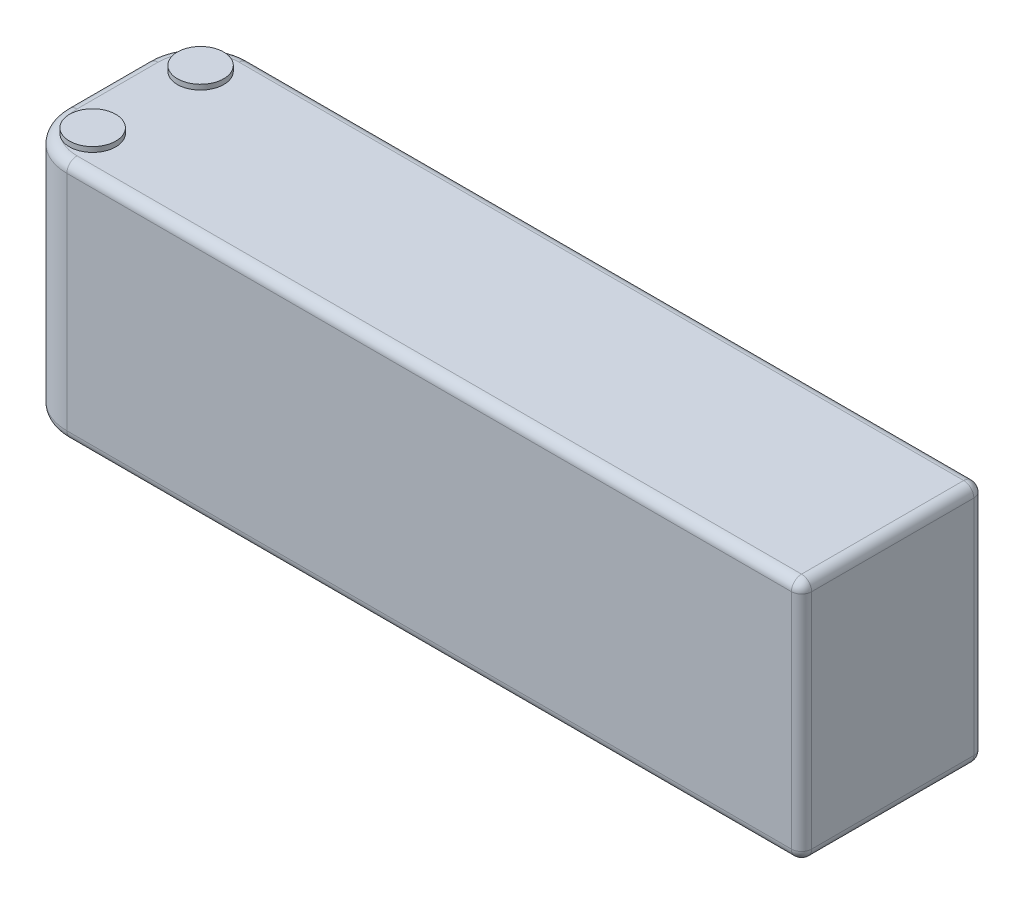
ISO-10303-21;
HEADER;
FILE_DESCRIPTION(('STEP AP214'),'2;1');
FILE_NAME('part.step','',(''),(''),'','','');
FILE_SCHEMA(('AUTOMOTIVE_DESIGN { 1 0 10303 214 1 1 1 1 }'));
ENDSEC;
DATA;
#1=APPLICATION_CONTEXT('core data for automotive mechanical design processes');
#2=APPLICATION_PROTOCOL_DEFINITION('international standard','automotive_design',2000,#1);
#3=PRODUCT_CONTEXT('',#1,'mechanical');
#4=PRODUCT('Part','Part','',(#3));
#5=PRODUCT_RELATED_PRODUCT_CATEGORY('part','',(#4));
#6=PRODUCT_DEFINITION_FORMATION('','',#4);
#7=PRODUCT_DEFINITION_CONTEXT('part definition',#1,'design');
#8=PRODUCT_DEFINITION('design','',#6,#7);
#9=PRODUCT_DEFINITION_SHAPE('','',#8);
#10=(LENGTH_UNIT() NAMED_UNIT(*) SI_UNIT(.MILLI.,.METRE.));
#11=(NAMED_UNIT(*) PLANE_ANGLE_UNIT() SI_UNIT($,.RADIAN.));
#12=(NAMED_UNIT(*) SI_UNIT($,.STERADIAN.) SOLID_ANGLE_UNIT());
#13=UNCERTAINTY_MEASURE_WITH_UNIT(LENGTH_MEASURE(1.E-05),#10,'distance_accuracy_value','');
#14=(GEOMETRIC_REPRESENTATION_CONTEXT(3) GLOBAL_UNCERTAINTY_ASSIGNED_CONTEXT((#13)) GLOBAL_UNIT_ASSIGNED_CONTEXT((#10,
#11,#12)) REPRESENTATION_CONTEXT('',''));
#15=CARTESIAN_POINT('',(0.,0.,0.));
#16=DIRECTION('',(0.,0.,1.));
#17=DIRECTION('',(1.,0.,0.));
#18=AXIS2_PLACEMENT_3D('',#15,#16,#17);
#19=CARTESIAN_POINT('',(116.511348847248,36.0060686410297,-9.));
#20=DIRECTION('',(-1.,0.,0.));
#21=DIRECTION('',(0.,0.,1.));
#22=AXIS2_PLACEMENT_3D('',#19,#20,#21);
#23=PLANE('',#22);
#24=DIRECTION('',(0.,0.,-1.));
#25=VECTOR('',#24,1.);
#26=CARTESIAN_POINT('',(116.511348847248,13.0060686410297,-9.));
#27=LINE('',#26,#25);
#28=CARTESIAN_POINT('',(116.511348847248,13.0060686410297,-10.));
#29=VERTEX_POINT('',#28);
#30=CARTESIAN_POINT('',(116.511348847248,13.0060686410297,-26.));
#31=VERTEX_POINT('',#30);
#32=EDGE_CURVE('E59',#29,#31,#27,.T.);
#33=ORIENTED_EDGE('',*,*,#32,.T.);
#34=DIRECTION('',(0.,-1.,0.));
#35=VECTOR('',#34,1.);
#36=CARTESIAN_POINT('',(116.511348847248,36.0060686410297,-26.));
#37=LINE('',#36,#35);
#38=CARTESIAN_POINT('',(116.511348847248,35.0060686410297,-26.));
#39=VERTEX_POINT('',#38);
#40=EDGE_CURVE('E11',#31,#39,#37,.F.);
#41=ORIENTED_EDGE('',*,*,#40,.T.);
#42=DIRECTION('',(0.,0.,-1.));
#43=VECTOR('',#42,1.);
#44=CARTESIAN_POINT('',(116.511348847248,35.0060686410297,-9.));
#45=LINE('',#44,#43);
#46=CARTESIAN_POINT('',(116.511348847248,35.0060686410297,-10.));
#47=VERTEX_POINT('',#46);
#48=EDGE_CURVE('E298',#39,#47,#45,.F.);
#49=ORIENTED_EDGE('',*,*,#48,.T.);
#50=DIRECTION('',(0.,-1.,0.));
#51=VECTOR('',#50,1.);
#52=CARTESIAN_POINT('',(116.511348847248,36.0060686410297,-10.));
#53=LINE('',#52,#51);
#54=EDGE_CURVE('E295',#47,#29,#53,.T.);
#55=ORIENTED_EDGE('',*,*,#54,.T.);
#56=EDGE_LOOP('',(#33,#41,#49,#55));
#57=FACE_BOUND('',#56,.T.);
#58=ADVANCED_FACE('F49',(#57),#23,.F.);
#59=CARTESIAN_POINT('',(116.511348847248,36.0060686410297,-27.));
#60=DIRECTION('',(0.,0.,1.));
#61=DIRECTION('',(1.,0.,0.));
#62=AXIS2_PLACEMENT_3D('',#59,#60,#61);
#63=PLANE('',#62);
#64=DIRECTION('',(0.,-1.,0.));
#65=VECTOR('',#64,1.);
#66=CARTESIAN_POINT('',(44.0113488472481,36.0060686410297,-27.));
#67=LINE('',#66,#65);
#68=CARTESIAN_POINT('',(44.0113488472481,35.0060686410297,-27.));
#69=VERTEX_POINT('',#68);
#70=CARTESIAN_POINT('',(44.0113488472481,13.0060686410297,-27.));
#71=VERTEX_POINT('',#70);
#72=EDGE_CURVE('E220',#69,#71,#67,.T.);
#73=ORIENTED_EDGE('',*,*,#72,.F.);
#74=DIRECTION('',(-1.,0.,0.));
#75=VECTOR('',#74,1.);
#76=CARTESIAN_POINT('',(116.511348847248,35.0060686410297,-27.));
#77=LINE('',#76,#75);
#78=CARTESIAN_POINT('',(115.511348847248,35.0060686410297,-27.));
#79=VERTEX_POINT('',#78);
#80=EDGE_CURVE('E284',#69,#79,#77,.F.);
#81=ORIENTED_EDGE('',*,*,#80,.T.);
#82=DIRECTION('',(0.,-1.,0.));
#83=VECTOR('',#82,1.);
#84=CARTESIAN_POINT('',(115.511348847248,36.0060686410297,-27.));
#85=LINE('',#84,#83);
#86=CARTESIAN_POINT('',(115.511348847248,13.0060686410297,-27.));
#87=VERTEX_POINT('',#86);
#88=EDGE_CURVE('E281',#79,#87,#85,.T.);
#89=ORIENTED_EDGE('',*,*,#88,.T.);
#90=DIRECTION('',(-1.,0.,0.));
#91=VECTOR('',#90,1.);
#92=CARTESIAN_POINT('',(116.511348847248,13.0060686410297,-27.));
#93=LINE('',#92,#91);
#94=EDGE_CURVE('E278',#87,#71,#93,.T.);
#95=ORIENTED_EDGE('',*,*,#94,.T.);
#96=EDGE_LOOP('',(#73,#81,#89,#95));
#97=FACE_BOUND('',#96,.T.);
#98=ADVANCED_FACE('F441',(#97),#63,.F.);
#99=CARTESIAN_POINT('',(44.0113488472481,36.0060686410297,-22.));
#100=DIRECTION('',(0.,-1.,0.));
#101=DIRECTION('',(0.,0.,-1.));
#102=AXIS2_PLACEMENT_3D('',#99,#100,#101);
#103=CYLINDRICAL_SURFACE('',#102,5.);
#104=DIRECTION('',(0.,-1.,0.));
#105=VECTOR('',#104,1.);
#106=CARTESIAN_POINT('',(39.0113488472481,36.0060686410297,-22.));
#107=LINE('',#106,#105);
#108=CARTESIAN_POINT('',(39.0113488472481,35.0060686410297,-22.));
#109=VERTEX_POINT('',#108);
#110=CARTESIAN_POINT('',(39.0113488472481,13.0060686410297,-22.));
#111=VERTEX_POINT('',#110);
#112=EDGE_CURVE('E216',#109,#111,#107,.T.);
#113=ORIENTED_EDGE('',*,*,#112,.F.);
#114=CARTESIAN_POINT('',(44.0113488472481,35.0060686410297,-22.));
#115=DIRECTION('',(0.,1.,0.));
#116=DIRECTION('',(0.,0.,1.));
#117=AXIS2_PLACEMENT_3D('',#114,#115,#116);
#118=CIRCLE('',#117,5.);
#119=EDGE_CURVE('E243',#109,#69,#118,.F.);
#120=ORIENTED_EDGE('',*,*,#119,.T.);
#121=ORIENTED_EDGE('',*,*,#72,.T.);
#122=CARTESIAN_POINT('',(44.0113488472481,13.0060686410297,-22.));
#123=DIRECTION('',(0.,1.,0.));
#124=DIRECTION('',(0.,0.,1.));
#125=AXIS2_PLACEMENT_3D('',#122,#123,#124);
#126=CIRCLE('',#125,5.);
#127=EDGE_CURVE('E240',#71,#111,#126,.T.);
#128=ORIENTED_EDGE('',*,*,#127,.T.);
#129=EDGE_LOOP('',(#113,#120,#121,#128));
#130=FACE_BOUND('',#129,.T.);
#131=ADVANCED_FACE('F429',(#130),#103,.T.);
#132=CARTESIAN_POINT('',(39.0113488472481,36.0060686410297,-22.));
#133=DIRECTION('',(1.,0.,0.));
#134=DIRECTION('',(0.,0.,-1.));
#135=AXIS2_PLACEMENT_3D('',#132,#133,#134);
#136=PLANE('',#135);
#137=DIRECTION('',(0.,-1.,0.));
#138=VECTOR('',#137,1.);
#139=CARTESIAN_POINT('',(39.0113488472481,36.0060686410297,-14.));
#140=LINE('',#139,#138);
#141=CARTESIAN_POINT('',(39.0113488472481,35.0060686410297,-14.));
#142=VERTEX_POINT('',#141);
#143=CARTESIAN_POINT('',(39.0113488472481,13.0060686410297,-14.));
#144=VERTEX_POINT('',#143);
#145=EDGE_CURVE('E212',#142,#144,#140,.T.);
#146=ORIENTED_EDGE('',*,*,#145,.F.);
#147=DIRECTION('',(0.,0.,1.));
#148=VECTOR('',#147,1.);
#149=CARTESIAN_POINT('',(39.0113488472481,35.0060686410297,-22.));
#150=LINE('',#149,#148);
#151=EDGE_CURVE('E250',#142,#109,#150,.F.);
#152=ORIENTED_EDGE('',*,*,#151,.T.);
#153=ORIENTED_EDGE('',*,*,#112,.T.);
#154=DIRECTION('',(0.,0.,1.));
#155=VECTOR('',#154,1.);
#156=CARTESIAN_POINT('',(39.0113488472481,13.0060686410297,-22.));
#157=LINE('',#156,#155);
#158=EDGE_CURVE('E247',#111,#144,#157,.T.);
#159=ORIENTED_EDGE('',*,*,#158,.T.);
#160=EDGE_LOOP('',(#146,#152,#153,#159));
#161=FACE_BOUND('',#160,.T.);
#162=ADVANCED_FACE('F426',(#161),#136,.F.);
#163=CARTESIAN_POINT('',(44.0113488472481,36.0060686410297,-14.));
#164=DIRECTION('',(0.,-1.,0.));
#165=DIRECTION('',(0.,0.,-1.));
#166=AXIS2_PLACEMENT_3D('',#163,#164,#165);
#167=CYLINDRICAL_SURFACE('',#166,5.);
#168=DIRECTION('',(0.,-1.,0.));
#169=VECTOR('',#168,1.);
#170=CARTESIAN_POINT('',(44.0113488472481,36.0060686410297,-9.));
#171=LINE('',#170,#169);
#172=CARTESIAN_POINT('',(44.0113488472481,35.0060686410297,-9.));
#173=VERTEX_POINT('',#172);
#174=CARTESIAN_POINT('',(44.0113488472481,13.0060686410297,-9.));
#175=VERTEX_POINT('',#174);
#176=EDGE_CURVE('E208',#173,#175,#171,.T.);
#177=ORIENTED_EDGE('',*,*,#176,.F.);
#178=CARTESIAN_POINT('',(44.0113488472481,35.0060686410297,-14.));
#179=DIRECTION('',(0.,1.,0.));
#180=DIRECTION('',(0.,0.,1.));
#181=AXIS2_PLACEMENT_3D('',#178,#179,#180);
#182=CIRCLE('',#181,5.);
#183=EDGE_CURVE('E256',#173,#142,#182,.F.);
#184=ORIENTED_EDGE('',*,*,#183,.T.);
#185=ORIENTED_EDGE('',*,*,#145,.T.);
#186=CARTESIAN_POINT('',(44.0113488472481,13.0060686410297,-14.));
#187=DIRECTION('',(0.,1.,0.));
#188=DIRECTION('',(0.,0.,1.));
#189=AXIS2_PLACEMENT_3D('',#186,#187,#188);
#190=CIRCLE('',#189,5.);
#191=EDGE_CURVE('E253',#144,#175,#190,.T.);
#192=ORIENTED_EDGE('',*,*,#191,.T.);
#193=EDGE_LOOP('',(#177,#184,#185,#192));
#194=FACE_BOUND('',#193,.T.);
#195=ADVANCED_FACE('F414',(#194),#167,.T.);
#196=CARTESIAN_POINT('',(44.0113488472481,36.0060686410297,-9.));
#197=DIRECTION('',(0.,0.,-1.));
#198=DIRECTION('',(-1.,0.,0.));
#199=AXIS2_PLACEMENT_3D('',#196,#197,#198);
#200=PLANE('',#199);
#201=ORIENTED_EDGE('',*,*,#176,.T.);
#202=DIRECTION('',(1.,0.,0.));
#203=VECTOR('',#202,1.);
#204=CARTESIAN_POINT('',(44.0113488472481,13.0060686410297,-9.));
#205=LINE('',#204,#203);
#206=CARTESIAN_POINT('',(115.511348847248,13.0060686410297,-9.));
#207=VERTEX_POINT('',#206);
#208=EDGE_CURVE('E292',#175,#207,#205,.T.);
#209=ORIENTED_EDGE('',*,*,#208,.T.);
#210=DIRECTION('',(0.,-1.,0.));
#211=VECTOR('',#210,1.);
#212=CARTESIAN_POINT('',(115.511348847248,36.0060686410297,-9.));
#213=LINE('',#212,#211);
#214=CARTESIAN_POINT('',(115.511348847248,35.0060686410297,-9.));
#215=VERTEX_POINT('',#214);
#216=EDGE_CURVE('E287',#207,#215,#213,.F.);
#217=ORIENTED_EDGE('',*,*,#216,.T.);
#218=DIRECTION('',(1.,0.,0.));
#219=VECTOR('',#218,1.);
#220=CARTESIAN_POINT('',(44.0113488472481,35.0060686410297,-9.));
#221=LINE('',#220,#219);
#222=EDGE_CURVE('E290',#215,#173,#221,.F.);
#223=ORIENTED_EDGE('',*,*,#222,.T.);
#224=EDGE_LOOP('',(#201,#209,#217,#223));
#225=FACE_BOUND('',#224,.T.);
#226=ADVANCED_FACE('F410',(#225),#200,.F.);
#227=CARTESIAN_POINT('',(44.0113488472481,36.0060686410297,-22.));
#228=DIRECTION('',(0.,1.,0.));
#229=DIRECTION('',(0.,0.,1.));
#230=AXIS2_PLACEMENT_3D('',#227,#228,#229);
#231=PLANE('',#230);
#232=CARTESIAN_POINT('',(44.0113488472481,36.0060686410297,-14.));
#233=DIRECTION('',(0.,1.,0.));
#234=DIRECTION('',(0.,0.,1.));
#235=AXIS2_PLACEMENT_3D('',#232,#233,#234);
#236=CIRCLE('',#235,4.);
#237=CARTESIAN_POINT('',(40.0113488472481,36.0060686410297,-14.));
#238=VERTEX_POINT('',#237);
#239=CARTESIAN_POINT('',(41.0240721815065,36.0060686410297,-11.3398913326114));
#240=VERTEX_POINT('',#239);
#241=EDGE_CURVE('E176',#238,#240,#236,.T.);
#242=ORIENTED_EDGE('',*,*,#241,.T.);
#243=CARTESIAN_POINT('',(42.8804186862972,36.0060686410297,-12.6745553317435));
#244=DIRECTION('',(0.,1.,0.));
#245=DIRECTION('',(0.,0.,-1.));
#246=AXIS2_PLACEMENT_3D('',#243,#244,#245);
#247=CIRCLE('',#246,2.28633994332166);
#248=CARTESIAN_POINT('',(41.8545561660014,36.0060686410297,-10.6312843203795));
#249=VERTEX_POINT('',#248);
#250=EDGE_CURVE('E178',#249,#240,#247,.T.);
#251=ORIENTED_EDGE('',*,*,#250,.F.);
#252=CARTESIAN_POINT('',(44.0113488472481,36.0060686410297,-10.));
#253=VERTEX_POINT('',#252);
#254=EDGE_CURVE('E165',#249,#253,#236,.T.);
#255=ORIENTED_EDGE('',*,*,#254,.T.);
#256=DIRECTION('',(1.,0.,0.));
#257=VECTOR('',#256,1.);
#258=CARTESIAN_POINT('',(116.511348847248,36.0060686410297,-10.));
#259=LINE('',#258,#257);
#260=CARTESIAN_POINT('',(115.511348847248,36.0060686410297,-10.));
#261=VERTEX_POINT('',#260);
#262=EDGE_CURVE('E227',#253,#261,#259,.T.);
#263=ORIENTED_EDGE('',*,*,#262,.T.);
#264=DIRECTION('',(0.,0.,-1.));
#265=VECTOR('',#264,1.);
#266=CARTESIAN_POINT('',(115.511348847248,36.0060686410297,-27.));
#267=LINE('',#266,#265);
#268=CARTESIAN_POINT('',(115.511348847248,36.0060686410297,-26.));
#269=VERTEX_POINT('',#268);
#270=EDGE_CURVE('E224',#261,#269,#267,.T.);
#271=ORIENTED_EDGE('',*,*,#270,.T.);
#272=DIRECTION('',(-1.,0.,0.));
#273=VECTOR('',#272,1.);
#274=CARTESIAN_POINT('',(44.0113488472481,36.0060686410297,-26.));
#275=LINE('',#274,#273);
#276=CARTESIAN_POINT('',(44.0113488472481,36.0060686410297,-26.));
#277=VERTEX_POINT('',#276);
#278=EDGE_CURVE('E174',#269,#277,#275,.T.);
#279=ORIENTED_EDGE('',*,*,#278,.T.);
#280=CARTESIAN_POINT('',(44.0113488472481,36.0060686410297,-22.));
#281=DIRECTION('',(0.,1.,0.));
#282=DIRECTION('',(0.,0.,1.));
#283=AXIS2_PLACEMENT_3D('',#280,#281,#282);
#284=CIRCLE('',#283,4.);
#285=CARTESIAN_POINT('',(41.8545561660014,36.0060686410297,-25.3687156796205));
#286=VERTEX_POINT('',#285);
#287=EDGE_CURVE('E237',#277,#286,#284,.T.);
#288=ORIENTED_EDGE('',*,*,#287,.T.);
#289=CARTESIAN_POINT('',(42.8804186862972,36.0060686410297,-23.3254446682565));
#290=DIRECTION('',(0.,1.,0.));
#291=DIRECTION('',(0.,0.,1.));
#292=AXIS2_PLACEMENT_3D('',#289,#290,#291);
#293=CIRCLE('',#292,2.28633994332166);
#294=CARTESIAN_POINT('',(41.0240721815065,36.0060686410297,-24.6601086673886));
#295=VERTEX_POINT('',#294);
#296=EDGE_CURVE('E196',#295,#286,#293,.T.);
#297=ORIENTED_EDGE('',*,*,#296,.F.);
#298=CARTESIAN_POINT('',(40.0113488472481,36.0060686410297,-22.));
#299=VERTEX_POINT('',#298);
#300=EDGE_CURVE('E236',#295,#299,#284,.T.);
#301=ORIENTED_EDGE('',*,*,#300,.T.);
#302=DIRECTION('',(0.,0.,1.));
#303=VECTOR('',#302,1.);
#304=CARTESIAN_POINT('',(40.0113488472481,36.0060686410297,-14.));
#305=LINE('',#304,#303);
#306=EDGE_CURVE('E233',#299,#238,#305,.T.);
#307=ORIENTED_EDGE('',*,*,#306,.T.);
#308=EDGE_LOOP('',(#242,#251,#255,#263,#271,#279,#288,#297,#301,#307));
#309=FACE_BOUND('',#308,.T.);
#310=ADVANCED_FACE('F179',(#309),#231,.T.);
#311=CARTESIAN_POINT('',(44.0113488472481,12.0060686410297,-22.));
#312=DIRECTION('',(0.,1.,0.));
#313=DIRECTION('',(0.,0.,1.));
#314=AXIS2_PLACEMENT_3D('',#311,#312,#313);
#315=PLANE('',#314);
#316=DIRECTION('',(1.,0.,0.));
#317=VECTOR('',#316,1.);
#318=CARTESIAN_POINT('',(44.0113488472481,12.0060686410297,-10.));
#319=LINE('',#318,#317);
#320=CARTESIAN_POINT('',(115.511348847248,12.0060686410297,-10.));
#321=VERTEX_POINT('',#320);
#322=CARTESIAN_POINT('',(44.0113488472481,12.0060686410297,-10.));
#323=VERTEX_POINT('',#322);
#324=EDGE_CURVE('E265',#321,#323,#319,.F.);
#325=ORIENTED_EDGE('',*,*,#324,.T.);
#326=CARTESIAN_POINT('',(44.0113488472481,12.0060686410297,-14.));
#327=DIRECTION('',(0.,1.,0.));
#328=DIRECTION('',(0.,0.,1.));
#329=AXIS2_PLACEMENT_3D('',#326,#327,#328);
#330=CIRCLE('',#329,4.);
#331=CARTESIAN_POINT('',(40.0113488472481,12.0060686410297,-14.));
#332=VERTEX_POINT('',#331);
#333=EDGE_CURVE('E274',#323,#332,#330,.F.);
#334=ORIENTED_EDGE('',*,*,#333,.T.);
#335=DIRECTION('',(0.,0.,1.));
#336=VECTOR('',#335,1.);
#337=CARTESIAN_POINT('',(40.0113488472481,12.0060686410297,-22.));
#338=LINE('',#337,#336);
#339=CARTESIAN_POINT('',(40.0113488472481,12.0060686410297,-22.));
#340=VERTEX_POINT('',#339);
#341=EDGE_CURVE('E271',#332,#340,#338,.F.);
#342=ORIENTED_EDGE('',*,*,#341,.T.);
#343=CARTESIAN_POINT('',(44.0113488472481,12.0060686410297,-22.));
#344=DIRECTION('',(0.,1.,0.));
#345=DIRECTION('',(0.,0.,1.));
#346=AXIS2_PLACEMENT_3D('',#343,#344,#345);
#347=CIRCLE('',#346,4.);
#348=CARTESIAN_POINT('',(44.0113488472481,12.0060686410297,-26.));
#349=VERTEX_POINT('',#348);
#350=EDGE_CURVE('E268',#340,#349,#347,.F.);
#351=ORIENTED_EDGE('',*,*,#350,.T.);
#352=DIRECTION('',(-1.,0.,0.));
#353=VECTOR('',#352,1.);
#354=CARTESIAN_POINT('',(44.0113488472481,12.0060686410297,-26.));
#355=LINE('',#354,#353);
#356=CARTESIAN_POINT('',(115.511348847248,12.0060686410297,-26.));
#357=VERTEX_POINT('',#356);
#358=EDGE_CURVE('E259',#349,#357,#355,.F.);
#359=ORIENTED_EDGE('',*,*,#358,.T.);
#360=DIRECTION('',(0.,0.,-1.));
#361=VECTOR('',#360,1.);
#362=CARTESIAN_POINT('',(115.511348847248,12.0060686410297,-22.));
#363=LINE('',#362,#361);
#364=EDGE_CURVE('E262',#357,#321,#363,.F.);
#365=ORIENTED_EDGE('',*,*,#364,.T.);
#366=EDGE_LOOP('',(#325,#334,#342,#351,#359,#365));
#367=FACE_BOUND('',#366,.T.);
#368=ADVANCED_FACE('F386',(#367),#315,.F.);
#369=CARTESIAN_POINT('',(44.0113488472481,13.0060686410297,-14.));
#370=DIRECTION('',(0.,1.,0.));
#371=DIRECTION('',(0.,0.,1.));
#372=AXIS2_PLACEMENT_3D('',#369,#370,#371);
#373=TOROIDAL_SURFACE('',#372,4.,1.);
#374=CARTESIAN_POINT('',(44.0113488472481,13.0060686410297,-10.));
#375=DIRECTION('',(1.,0.,0.));
#376=DIRECTION('',(0.,0.,-1.));
#377=AXIS2_PLACEMENT_3D('',#374,#375,#376);
#378=CIRCLE('',#377,1.);
#379=EDGE_CURVE('E368',#175,#323,#378,.T.);
#380=ORIENTED_EDGE('',*,*,#379,.F.);
#381=ORIENTED_EDGE('',*,*,#191,.F.);
#382=CARTESIAN_POINT('',(40.0113488472481,13.0060686410297,-14.));
#383=DIRECTION('',(0.,0.,-1.));
#384=DIRECTION('',(-1.,0.,0.));
#385=AXIS2_PLACEMENT_3D('',#382,#383,#384);
#386=CIRCLE('',#385,1.);
#387=EDGE_CURVE('E53',#332,#144,#386,.T.);
#388=ORIENTED_EDGE('',*,*,#387,.F.);
#389=ORIENTED_EDGE('',*,*,#333,.F.);
#390=EDGE_LOOP('',(#380,#381,#388,#389));
#391=FACE_BOUND('',#390,.T.);
#392=ADVANCED_FACE('F51',(#391),#373,.T.);
#393=CARTESIAN_POINT('',(40.0113488472481,13.0060686410297,-22.));
#394=DIRECTION('',(0.,0.,1.));
#395=DIRECTION('',(1.,0.,0.));
#396=AXIS2_PLACEMENT_3D('',#393,#394,#395);
#397=CYLINDRICAL_SURFACE('',#396,1.);
#398=ORIENTED_EDGE('',*,*,#387,.T.);
#399=ORIENTED_EDGE('',*,*,#158,.F.);
#400=CARTESIAN_POINT('',(40.0113488472481,13.0060686410297,-22.));
#401=DIRECTION('',(0.,0.,-1.));
#402=DIRECTION('',(-1.,0.,0.));
#403=AXIS2_PLACEMENT_3D('',#400,#401,#402);
#404=CIRCLE('',#403,1.);
#405=EDGE_CURVE('E365',#340,#111,#404,.T.);
#406=ORIENTED_EDGE('',*,*,#405,.F.);
#407=ORIENTED_EDGE('',*,*,#341,.F.);
#408=EDGE_LOOP('',(#398,#399,#406,#407));
#409=FACE_BOUND('',#408,.T.);
#410=ADVANCED_FACE('F380',(#409),#397,.T.);
#411=CARTESIAN_POINT('',(44.0113488472481,13.0060686410297,-10.));
#412=DIRECTION('',(1.,0.,0.));
#413=DIRECTION('',(0.,0.,-1.));
#414=AXIS2_PLACEMENT_3D('',#411,#412,#413);
#415=CYLINDRICAL_SURFACE('',#414,1.);
#416=ORIENTED_EDGE('',*,*,#379,.T.);
#417=ORIENTED_EDGE('',*,*,#324,.F.);
#418=CARTESIAN_POINT('',(115.511348847248,13.0060686410297,-10.));
#419=DIRECTION('',(1.,0.,0.));
#420=DIRECTION('',(0.,0.,-1.));
#421=AXIS2_PLACEMENT_3D('',#418,#419,#420);
#422=CIRCLE('',#421,1.);
#423=EDGE_CURVE('E361',#207,#321,#422,.T.);
#424=ORIENTED_EDGE('',*,*,#423,.F.);
#425=ORIENTED_EDGE('',*,*,#208,.F.);
#426=EDGE_LOOP('',(#416,#417,#424,#425));
#427=FACE_BOUND('',#426,.T.);
#428=ADVANCED_FACE('F389',(#427),#415,.T.);
#429=CARTESIAN_POINT('',(44.0113488472481,13.0060686410297,-22.));
#430=DIRECTION('',(0.,1.,0.));
#431=DIRECTION('',(0.,0.,1.));
#432=AXIS2_PLACEMENT_3D('',#429,#430,#431);
#433=TOROIDAL_SURFACE('',#432,4.,1.);
#434=ORIENTED_EDGE('',*,*,#405,.T.);
#435=ORIENTED_EDGE('',*,*,#127,.F.);
#436=CARTESIAN_POINT('',(44.0113488472481,13.0060686410297,-26.));
#437=DIRECTION('',(1.,0.,0.));
#438=DIRECTION('',(0.,0.,-1.));
#439=AXIS2_PLACEMENT_3D('',#436,#437,#438);
#440=CIRCLE('',#439,1.);
#441=EDGE_CURVE('E357',#349,#71,#440,.T.);
#442=ORIENTED_EDGE('',*,*,#441,.F.);
#443=ORIENTED_EDGE('',*,*,#350,.F.);
#444=EDGE_LOOP('',(#434,#435,#442,#443));
#445=FACE_BOUND('',#444,.T.);
#446=ADVANCED_FACE('F679',(#445),#433,.T.);
#447=CARTESIAN_POINT('',(115.511348847248,13.0060686410297,-10.));
#448=DIRECTION('',(0.,-1.,0.));
#449=DIRECTION('',(0.,0.,-1.));
#450=AXIS2_PLACEMENT_3D('',#447,#448,#449);
#451=SPHERICAL_SURFACE('',#450,1.);
#452=CARTESIAN_POINT('',(115.511348847248,13.0060686410297,-10.));
#453=DIRECTION('',(0.,-1.,0.));
#454=DIRECTION('',(0.,0.,-1.));
#455=AXIS2_PLACEMENT_3D('',#452,#453,#454);
#456=CIRCLE('',#455,1.);
#457=EDGE_CURVE('E349',#207,#29,#456,.F.);
#458=ORIENTED_EDGE('',*,*,#457,.F.);
#459=ORIENTED_EDGE('',*,*,#423,.T.);
#460=CARTESIAN_POINT('',(115.511348847248,13.0060686410297,-10.));
#461=DIRECTION('',(0.,0.,1.));
#462=DIRECTION('',(1.,0.,0.));
#463=AXIS2_PLACEMENT_3D('',#460,#461,#462);
#464=CIRCLE('',#463,1.);
#465=EDGE_CURVE('E353',#29,#321,#464,.F.);
#466=ORIENTED_EDGE('',*,*,#465,.F.);
#467=EDGE_LOOP('',(#458,#459,#466));
#468=FACE_BOUND('',#467,.T.);
#469=ADVANCED_FACE('F393',(#468),#451,.T.);
#470=CARTESIAN_POINT('',(116.511348847248,13.0060686410297,-26.));
#471=DIRECTION('',(-1.,0.,0.));
#472=DIRECTION('',(0.,0.,1.));
#473=AXIS2_PLACEMENT_3D('',#470,#471,#472);
#474=CYLINDRICAL_SURFACE('',#473,1.);
#475=ORIENTED_EDGE('',*,*,#441,.T.);
#476=ORIENTED_EDGE('',*,*,#94,.F.);
#477=CARTESIAN_POINT('',(115.511348847248,13.0060686410297,-26.));
#478=DIRECTION('',(1.,0.,0.));
#479=DIRECTION('',(0.,0.,-1.));
#480=AXIS2_PLACEMENT_3D('',#477,#478,#479);
#481=CIRCLE('',#480,1.);
#482=EDGE_CURVE('E345',#357,#87,#481,.T.);
#483=ORIENTED_EDGE('',*,*,#482,.F.);
#484=ORIENTED_EDGE('',*,*,#358,.F.);
#485=EDGE_LOOP('',(#475,#476,#483,#484));
#486=FACE_BOUND('',#485,.T.);
#487=ADVANCED_FACE('F662',(#486),#474,.T.);
#488=CARTESIAN_POINT('',(115.511348847248,13.0060686410297,-9.));
#489=DIRECTION('',(0.,0.,-1.));
#490=DIRECTION('',(-1.,0.,0.));
#491=AXIS2_PLACEMENT_3D('',#488,#489,#490);
#492=CYLINDRICAL_SURFACE('',#491,1.);
#493=ORIENTED_EDGE('',*,*,#465,.T.);
#494=ORIENTED_EDGE('',*,*,#364,.F.);
#495=CARTESIAN_POINT('',(115.511348847248,13.0060686410297,-26.));
#496=DIRECTION('',(0.,0.,-1.));
#497=DIRECTION('',(-1.,0.,0.));
#498=AXIS2_PLACEMENT_3D('',#495,#496,#497);
#499=CIRCLE('',#498,1.);
#500=EDGE_CURVE('E341',#31,#357,#499,.T.);
#501=ORIENTED_EDGE('',*,*,#500,.F.);
#502=ORIENTED_EDGE('',*,*,#32,.F.);
#503=EDGE_LOOP('',(#493,#494,#501,#502));
#504=FACE_BOUND('',#503,.T.);
#505=ADVANCED_FACE('F397',(#504),#492,.T.);
#506=CARTESIAN_POINT('',(115.511348847248,36.0060686410297,-10.));
#507=DIRECTION('',(0.,-1.,0.));
#508=DIRECTION('',(0.,0.,-1.));
#509=AXIS2_PLACEMENT_3D('',#506,#507,#508);
#510=CYLINDRICAL_SURFACE('',#509,1.);
#511=ORIENTED_EDGE('',*,*,#457,.T.);
#512=ORIENTED_EDGE('',*,*,#54,.F.);
#513=CARTESIAN_POINT('',(115.511348847248,35.0060686410297,-10.));
#514=DIRECTION('',(0.,1.,0.));
#515=DIRECTION('',(0.,0.,1.));
#516=AXIS2_PLACEMENT_3D('',#513,#514,#515);
#517=CIRCLE('',#516,1.);
#518=EDGE_CURVE('E337',#215,#47,#517,.T.);
#519=ORIENTED_EDGE('',*,*,#518,.F.);
#520=ORIENTED_EDGE('',*,*,#216,.F.);
#521=EDGE_LOOP('',(#511,#512,#519,#520));
#522=FACE_BOUND('',#521,.T.);
#523=ADVANCED_FACE('F407',(#522),#510,.T.);
#524=CARTESIAN_POINT('',(115.511348847248,13.0060686410297,-26.));
#525=DIRECTION('',(0.,-1.,0.));
#526=DIRECTION('',(0.,0.,-1.));
#527=AXIS2_PLACEMENT_3D('',#524,#525,#526);
#528=SPHERICAL_SURFACE('',#527,1.);
#529=ORIENTED_EDGE('',*,*,#500,.T.);
#530=ORIENTED_EDGE('',*,*,#482,.T.);
#531=CARTESIAN_POINT('',(115.511348847248,13.0060686410297,-26.));
#532=DIRECTION('',(0.,-1.,0.));
#533=DIRECTION('',(0.,0.,-1.));
#534=AXIS2_PLACEMENT_3D('',#531,#532,#533);
#535=CIRCLE('',#534,1.);
#536=EDGE_CURVE('E333',#31,#87,#535,.F.);
#537=ORIENTED_EDGE('',*,*,#536,.F.);
#538=EDGE_LOOP('',(#529,#530,#537));
#539=FACE_BOUND('',#538,.T.);
#540=ADVANCED_FACE('F456',(#539),#528,.T.);
#541=CARTESIAN_POINT('',(115.511348847248,35.0060686410297,-10.));
#542=DIRECTION('',(1.,0.,0.));
#543=DIRECTION('',(0.,0.,-1.));
#544=AXIS2_PLACEMENT_3D('',#541,#542,#543);
#545=SPHERICAL_SURFACE('',#544,1.);
#546=CARTESIAN_POINT('',(115.511348847248,35.0060686410297,-10.));
#547=DIRECTION('',(1.,0.,0.));
#548=DIRECTION('',(0.,0.,-1.));
#549=AXIS2_PLACEMENT_3D('',#546,#547,#548);
#550=CIRCLE('',#549,1.);
#551=EDGE_CURVE('E325',#215,#261,#550,.F.);
#552=ORIENTED_EDGE('',*,*,#551,.F.);
#553=ORIENTED_EDGE('',*,*,#518,.T.);
#554=CARTESIAN_POINT('',(115.511348847248,35.0060686410297,-10.));
#555=DIRECTION('',(0.,0.,1.));
#556=DIRECTION('',(0.,-1.,0.));
#557=AXIS2_PLACEMENT_3D('',#554,#555,#556);
#558=CIRCLE('',#557,1.);
#559=EDGE_CURVE('E329',#261,#47,#558,.F.);
#560=ORIENTED_EDGE('',*,*,#559,.F.);
#561=EDGE_LOOP('',(#552,#553,#560));
#562=FACE_BOUND('',#561,.T.);
#563=ADVANCED_FACE('F454',(#562),#545,.T.);
#564=CARTESIAN_POINT('',(115.511348847248,36.0060686410297,-26.));
#565=DIRECTION('',(0.,-1.,0.));
#566=DIRECTION('',(0.,0.,-1.));
#567=AXIS2_PLACEMENT_3D('',#564,#565,#566);
#568=CYLINDRICAL_SURFACE('',#567,1.);
#569=ORIENTED_EDGE('',*,*,#536,.T.);
#570=ORIENTED_EDGE('',*,*,#88,.F.);
#571=CARTESIAN_POINT('',(115.511348847248,35.0060686410297,-26.));
#572=DIRECTION('',(0.,1.,0.));
#573=DIRECTION('',(0.,0.,1.));
#574=AXIS2_PLACEMENT_3D('',#571,#572,#573);
#575=CIRCLE('',#574,1.);
#576=EDGE_CURVE('E321',#39,#79,#575,.T.);
#577=ORIENTED_EDGE('',*,*,#576,.F.);
#578=ORIENTED_EDGE('',*,*,#40,.F.);
#579=EDGE_LOOP('',(#569,#570,#577,#578));
#580=FACE_BOUND('',#579,.T.);
#581=ADVANCED_FACE('F445',(#580),#568,.T.);
#582=CARTESIAN_POINT('',(115.511348847248,35.0060686410297,-22.));
#583=DIRECTION('',(0.,0.,1.));
#584=DIRECTION('',(1.,0.,0.));
#585=AXIS2_PLACEMENT_3D('',#582,#583,#584);
#586=CYLINDRICAL_SURFACE('',#585,1.);
#587=ORIENTED_EDGE('',*,*,#559,.T.);
#588=ORIENTED_EDGE('',*,*,#48,.F.);
#589=CARTESIAN_POINT('',(115.511348847248,35.0060686410297,-26.));
#590=DIRECTION('',(0.,0.,-1.));
#591=DIRECTION('',(-1.,0.,0.));
#592=AXIS2_PLACEMENT_3D('',#589,#590,#591);
#593=CIRCLE('',#592,1.);
#594=EDGE_CURVE('E318',#269,#39,#593,.T.);
#595=ORIENTED_EDGE('',*,*,#594,.F.);
#596=ORIENTED_EDGE('',*,*,#270,.F.);
#597=EDGE_LOOP('',(#587,#588,#595,#596));
#598=FACE_BOUND('',#597,.T.);
#599=ADVANCED_FACE('F451',(#598),#586,.T.);
#600=CARTESIAN_POINT('',(44.0113488472481,35.0060686410297,-10.));
#601=DIRECTION('',(-1.,0.,0.));
#602=DIRECTION('',(0.,0.,1.));
#603=AXIS2_PLACEMENT_3D('',#600,#601,#602);
#604=CYLINDRICAL_SURFACE('',#603,1.);
#605=ORIENTED_EDGE('',*,*,#551,.T.);
#606=ORIENTED_EDGE('',*,*,#262,.F.);
#607=CARTESIAN_POINT('',(44.0113488472481,35.0060686410297,-10.));
#608=DIRECTION('',(-1.,0.,0.));
#609=DIRECTION('',(0.,-1.,0.));
#610=AXIS2_PLACEMENT_3D('',#607,#608,#609);
#611=CIRCLE('',#610,1.);
#612=EDGE_CURVE('E170',#173,#253,#611,.T.);
#613=ORIENTED_EDGE('',*,*,#612,.F.);
#614=ORIENTED_EDGE('',*,*,#222,.F.);
#615=EDGE_LOOP('',(#605,#606,#613,#614));
#616=FACE_BOUND('',#615,.T.);
#617=ADVANCED_FACE('F417',(#616),#604,.T.);
#618=CARTESIAN_POINT('',(115.511348847248,35.0060686410297,-26.));
#619=DIRECTION('',(1.,0.,0.));
#620=DIRECTION('',(0.,0.,-1.));
#621=AXIS2_PLACEMENT_3D('',#618,#619,#620);
#622=SPHERICAL_SURFACE('',#621,1.);
#623=ORIENTED_EDGE('',*,*,#594,.T.);
#624=ORIENTED_EDGE('',*,*,#576,.T.);
#625=CARTESIAN_POINT('',(115.511348847248,35.0060686410297,-26.));
#626=DIRECTION('',(1.,0.,0.));
#627=DIRECTION('',(0.,0.,-1.));
#628=AXIS2_PLACEMENT_3D('',#625,#626,#627);
#629=CIRCLE('',#628,1.);
#630=EDGE_CURVE('E313',#269,#79,#629,.F.);
#631=ORIENTED_EDGE('',*,*,#630,.F.);
#632=EDGE_LOOP('',(#623,#624,#631));
#633=FACE_BOUND('',#632,.T.);
#634=ADVANCED_FACE('F447',(#633),#622,.T.);
#635=CARTESIAN_POINT('',(44.0113488472481,35.0060686410297,-14.));
#636=DIRECTION('',(0.,1.,0.));
#637=DIRECTION('',(0.,0.,1.));
#638=AXIS2_PLACEMENT_3D('',#635,#636,#637);
#639=TOROIDAL_SURFACE('',#638,4.,1.);
#640=ORIENTED_EDGE('',*,*,#612,.T.);
#641=ORIENTED_EDGE('',*,*,#254,.F.);
#642=EDGE_CURVE('E67',#240,#249,#236,.T.);
#643=ORIENTED_EDGE('',*,*,#642,.F.);
#644=ORIENTED_EDGE('',*,*,#241,.F.);
#645=CARTESIAN_POINT('',(40.0113488472481,35.0060686410297,-14.));
#646=DIRECTION('',(0.,0.,-1.));
#647=DIRECTION('',(-1.,0.,0.));
#648=AXIS2_PLACEMENT_3D('',#645,#646,#647);
#649=CIRCLE('',#648,1.);
#650=EDGE_CURVE('E309',#142,#238,#649,.T.);
#651=ORIENTED_EDGE('',*,*,#650,.F.);
#652=ORIENTED_EDGE('',*,*,#183,.F.);
#653=EDGE_LOOP('',(#640,#641,#643,#644,#651,#652));
#654=FACE_BOUND('',#653,.T.);
#655=ADVANCED_FACE('F167',(#654),#639,.T.);
#656=CARTESIAN_POINT('',(44.0113488472481,35.0060686410297,-26.));
#657=DIRECTION('',(1.,0.,0.));
#658=DIRECTION('',(0.,0.,-1.));
#659=AXIS2_PLACEMENT_3D('',#656,#657,#658);
#660=CYLINDRICAL_SURFACE('',#659,1.);
#661=ORIENTED_EDGE('',*,*,#630,.T.);
#662=ORIENTED_EDGE('',*,*,#80,.F.);
#663=CARTESIAN_POINT('',(44.0113488472481,35.0060686410297,-26.));
#664=DIRECTION('',(-1.,0.,0.));
#665=DIRECTION('',(0.,0.,1.));
#666=AXIS2_PLACEMENT_3D('',#663,#664,#665);
#667=CIRCLE('',#666,1.);
#668=EDGE_CURVE('E306',#277,#69,#667,.T.);
#669=ORIENTED_EDGE('',*,*,#668,.F.);
#670=ORIENTED_EDGE('',*,*,#278,.F.);
#671=EDGE_LOOP('',(#661,#662,#669,#670));
#672=FACE_BOUND('',#671,.T.);
#673=ADVANCED_FACE('F437',(#672),#660,.T.);
#674=CARTESIAN_POINT('',(40.0113488472481,35.0060686410297,-22.));
#675=DIRECTION('',(0.,0.,-1.));
#676=DIRECTION('',(-1.,0.,0.));
#677=AXIS2_PLACEMENT_3D('',#674,#675,#676);
#678=CYLINDRICAL_SURFACE('',#677,1.);
#679=ORIENTED_EDGE('',*,*,#650,.T.);
#680=ORIENTED_EDGE('',*,*,#306,.F.);
#681=CARTESIAN_POINT('',(40.0113488472481,35.0060686410297,-22.));
#682=DIRECTION('',(0.,0.,-1.));
#683=DIRECTION('',(0.,1.,0.));
#684=AXIS2_PLACEMENT_3D('',#681,#682,#683);
#685=CIRCLE('',#684,1.);
#686=EDGE_CURVE('E203',#109,#299,#685,.T.);
#687=ORIENTED_EDGE('',*,*,#686,.F.);
#688=ORIENTED_EDGE('',*,*,#151,.F.);
#689=EDGE_LOOP('',(#679,#680,#687,#688));
#690=FACE_BOUND('',#689,.T.);
#691=ADVANCED_FACE('F423',(#690),#678,.T.);
#692=CARTESIAN_POINT('',(44.0113488472481,35.0060686410297,-22.));
#693=DIRECTION('',(0.,1.,0.));
#694=DIRECTION('',(0.,0.,1.));
#695=AXIS2_PLACEMENT_3D('',#692,#693,#694);
#696=TOROIDAL_SURFACE('',#695,4.,1.);
#697=ORIENTED_EDGE('',*,*,#668,.T.);
#698=ORIENTED_EDGE('',*,*,#119,.F.);
#699=ORIENTED_EDGE('',*,*,#686,.T.);
#700=ORIENTED_EDGE('',*,*,#300,.F.);
#701=EDGE_CURVE('E75',#286,#295,#284,.T.);
#702=ORIENTED_EDGE('',*,*,#701,.F.);
#703=ORIENTED_EDGE('',*,*,#287,.F.);
#704=EDGE_LOOP('',(#697,#698,#699,#700,#702,#703));
#705=FACE_BOUND('',#704,.T.);
#706=ADVANCED_FACE('F432',(#705),#696,.T.);
#707=CARTESIAN_POINT('',(42.8804186862972,36.5060686410297,-23.3254446682565));
#708=DIRECTION('',(0.,-1.,0.));
#709=DIRECTION('',(0.,0.,-1.));
#710=AXIS2_PLACEMENT_3D('',#707,#708,#709);
#711=CYLINDRICAL_SURFACE('',#710,2.28633994332166);
#712=CARTESIAN_POINT('',(42.8804186862972,36.5060686410297,-23.3254446682565));
#713=DIRECTION('',(0.,1.,0.));
#714=DIRECTION('',(0.,0.,1.));
#715=AXIS2_PLACEMENT_3D('',#712,#713,#714);
#716=CIRCLE('',#715,2.28633994332166);
#717=CARTESIAN_POINT('',(42.8804186862972,36.5060686410297,-21.0391047249348));
#718=VERTEX_POINT('',#717);
#719=EDGE_CURVE('E199',#718,#718,#716,.T.);
#720=ORIENTED_EDGE('',*,*,#719,.F.);
#721=EDGE_LOOP('',(#720));
#722=FACE_BOUND('',#721,.T.);
#723=EDGE_CURVE('E204',#286,#295,#293,.T.);
#724=ORIENTED_EDGE('',*,*,#723,.T.);
#725=ORIENTED_EDGE('',*,*,#296,.T.);
#726=EDGE_LOOP('',(#724,#725));
#727=FACE_BOUND('',#726,.T.);
#728=ADVANCED_FACE('F475',(#722,#727),#711,.T.);
#729=CARTESIAN_POINT('',(42.8804186862972,36.5060686410297,-23.3254446682565));
#730=DIRECTION('',(0.,1.,0.));
#731=DIRECTION('',(0.,0.,1.));
#732=AXIS2_PLACEMENT_3D('',#729,#730,#731);
#733=PLANE('',#732);
#734=ORIENTED_EDGE('',*,*,#719,.T.);
#735=EDGE_LOOP('',(#734));
#736=FACE_BOUND('',#735,.T.);
#737=ADVANCED_FACE('F521',(#736),#733,.T.);
#738=CARTESIAN_POINT('',(42.8804186862972,36.0060686410297,-23.3254446682565));
#739=DIRECTION('',(0.,1.,0.));
#740=DIRECTION('',(0.,0.,1.));
#741=AXIS2_PLACEMENT_3D('',#738,#739,#740);
#742=PLANE('',#741);
#743=ORIENTED_EDGE('',*,*,#701,.T.);
#744=ORIENTED_EDGE('',*,*,#723,.F.);
#745=EDGE_LOOP('',(#743,#744));
#746=FACE_BOUND('',#745,.T.);
#747=ADVANCED_FACE('F529',(#746),#742,.F.);
#748=CARTESIAN_POINT('',(42.8804186862972,36.5060686410297,-12.6745553317435));
#749=DIRECTION('',(0.,-1.,0.));
#750=DIRECTION('',(0.,0.,-1.));
#751=AXIS2_PLACEMENT_3D('',#748,#749,#750);
#752=CYLINDRICAL_SURFACE('',#751,2.28633994332166);
#753=CARTESIAN_POINT('',(42.8804186862972,36.5060686410297,-12.6745553317435));
#754=DIRECTION('',(0.,1.,0.));
#755=DIRECTION('',(0.,0.,-1.));
#756=AXIS2_PLACEMENT_3D('',#753,#754,#755);
#757=CIRCLE('',#756,2.28633994332166);
#758=CARTESIAN_POINT('',(42.8804186862972,36.5060686410297,-14.9608952750652));
#759=VERTEX_POINT('',#758);
#760=EDGE_CURVE('E191',#759,#759,#757,.T.);
#761=ORIENTED_EDGE('',*,*,#760,.F.);
#762=EDGE_LOOP('',(#761));
#763=FACE_BOUND('',#762,.T.);
#764=EDGE_CURVE('E184',#240,#249,#247,.T.);
#765=ORIENTED_EDGE('',*,*,#764,.T.);
#766=ORIENTED_EDGE('',*,*,#250,.T.);
#767=EDGE_LOOP('',(#765,#766));
#768=FACE_BOUND('',#767,.T.);
#769=ADVANCED_FACE('F189',(#763,#768),#752,.T.);
#770=CARTESIAN_POINT('',(42.8804186862972,36.5060686410297,-12.6745553317435));
#771=DIRECTION('',(0.,-1.,0.));
#772=DIRECTION('',(0.,0.,-1.));
#773=AXIS2_PLACEMENT_3D('',#770,#771,#772);
#774=PLANE('',#773);
#775=ORIENTED_EDGE('',*,*,#760,.T.);
#776=EDGE_LOOP('',(#775));
#777=FACE_BOUND('',#776,.T.);
#778=ADVANCED_FACE('F545',(#777),#774,.F.);
#779=CARTESIAN_POINT('',(42.8804186862972,36.0060686410297,-12.6745553317435));
#780=DIRECTION('',(0.,-1.,0.));
#781=DIRECTION('',(0.,0.,-1.));
#782=AXIS2_PLACEMENT_3D('',#779,#780,#781);
#783=PLANE('',#782);
#784=ORIENTED_EDGE('',*,*,#642,.T.);
#785=ORIENTED_EDGE('',*,*,#764,.F.);
#786=EDGE_LOOP('',(#784,#785));
#787=FACE_BOUND('',#786,.T.);
#788=ADVANCED_FACE('F187',(#787),#783,.T.);
#789=CLOSED_SHELL('',(#58,#98,#131,#162,#195,#226,#310,#368,#392,#410,#428,#446,#469,#487,#505,
#523,#540,#563,#581,#599,#617,#634,#655,#673,#691,#706,#728,#737,#747,#769,#778,#788));
#790=MANIFOLD_SOLID_BREP('B2',#789);
#791=ADVANCED_BREP_SHAPE_REPRESENTATION('',(#18,#790),#14);
#792=SHAPE_DEFINITION_REPRESENTATION(#9,#791);
ENDSEC;
END-ISO-10303-21;
